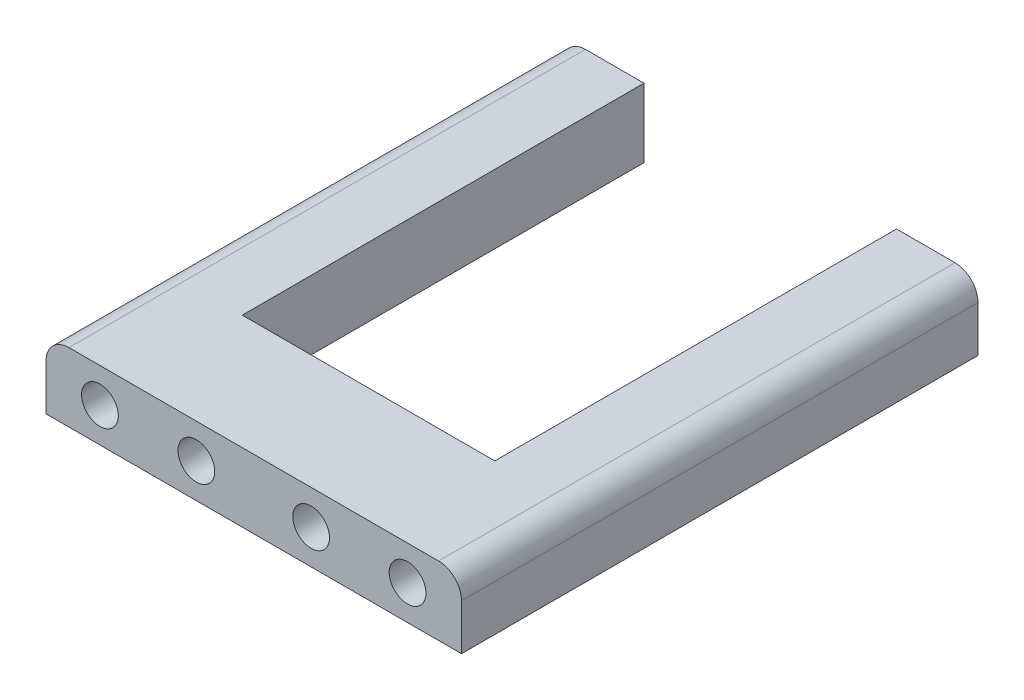
ISO-10303-21;
HEADER;
FILE_DESCRIPTION(('STEP AP214'),'2;1');
FILE_NAME('part.step','',(''),(''),'','','');
FILE_SCHEMA(('AUTOMOTIVE_DESIGN { 1 0 10303 214 1 1 1 1 }'));
ENDSEC;
DATA;
#1=APPLICATION_CONTEXT('core data for automotive mechanical design processes');
#2=APPLICATION_PROTOCOL_DEFINITION('international standard','automotive_design',2000,#1);
#3=PRODUCT_CONTEXT('',#1,'mechanical');
#4=PRODUCT('Part','Part','',(#3));
#5=PRODUCT_RELATED_PRODUCT_CATEGORY('part','',(#4));
#6=PRODUCT_DEFINITION_FORMATION('','',#4);
#7=PRODUCT_DEFINITION_CONTEXT('part definition',#1,'design');
#8=PRODUCT_DEFINITION('design','',#6,#7);
#9=PRODUCT_DEFINITION_SHAPE('','',#8);
#10=(LENGTH_UNIT() NAMED_UNIT(*) SI_UNIT(.MILLI.,.METRE.));
#11=(NAMED_UNIT(*) PLANE_ANGLE_UNIT() SI_UNIT($,.RADIAN.));
#12=(NAMED_UNIT(*) SI_UNIT($,.STERADIAN.) SOLID_ANGLE_UNIT());
#13=UNCERTAINTY_MEASURE_WITH_UNIT(LENGTH_MEASURE(1.E-05),#10,'distance_accuracy_value','');
#14=(GEOMETRIC_REPRESENTATION_CONTEXT(3) GLOBAL_UNCERTAINTY_ASSIGNED_CONTEXT((#13)) GLOBAL_UNIT_ASSIGNED_CONTEXT((#10,
#11,#12)) REPRESENTATION_CONTEXT('',''));
#15=CARTESIAN_POINT('',(0.,0.,0.));
#16=DIRECTION('',(0.,0.,1.));
#17=DIRECTION('',(1.,0.,0.));
#18=AXIS2_PLACEMENT_3D('',#15,#16,#17);
#19=CARTESIAN_POINT('',(-18.1,6.,-22.5));
#20=DIRECTION('',(0.,0.,1.));
#21=DIRECTION('',(1.,0.,0.));
#22=AXIS2_PLACEMENT_3D('',#19,#20,#21);
#23=PLANE('',#22);
#24=CARTESIAN_POINT('',(-13.4,3.,-22.5));
#25=DIRECTION('',(0.,0.,1.));
#26=DIRECTION('',(1.,0.,0.));
#27=AXIS2_PLACEMENT_3D('',#24,#25,#26);
#28=CIRCLE('',#27,1.6);
#29=CARTESIAN_POINT('',(-11.8,3.,-22.5));
#30=VERTEX_POINT('',#29);
#31=EDGE_CURVE('E156',#30,#30,#28,.T.);
#32=ORIENTED_EDGE('',*,*,#31,.T.);
#33=EDGE_LOOP('',(#32));
#34=FACE_BOUND('',#33,.T.);
#35=DIRECTION('',(0.,-1.,0.));
#36=VECTOR('',#35,1.);
#37=CARTESIAN_POINT('',(-18.1,6.,-22.5));
#38=LINE('',#37,#36);
#39=CARTESIAN_POINT('',(-18.1,4.,-22.5));
#40=VERTEX_POINT('',#39);
#41=CARTESIAN_POINT('',(-18.1,0.,-22.5));
#42=VERTEX_POINT('',#41);
#43=EDGE_CURVE('E196',#40,#42,#38,.T.);
#44=ORIENTED_EDGE('',*,*,#43,.F.);
#45=CARTESIAN_POINT('',(-16.1,4.,-22.5));
#46=DIRECTION('',(0.,0.,1.));
#47=DIRECTION('',(1.,0.,0.));
#48=AXIS2_PLACEMENT_3D('',#45,#46,#47);
#49=CIRCLE('',#48,2.);
#50=CARTESIAN_POINT('',(-16.1,6.,-22.5));
#51=VERTEX_POINT('',#50);
#52=EDGE_CURVE('E213',#40,#51,#49,.F.);
#53=ORIENTED_EDGE('',*,*,#52,.T.);
#54=DIRECTION('',(-1.,0.,0.));
#55=VECTOR('',#54,1.);
#56=CARTESIAN_POINT('',(-18.1,6.,-22.5));
#57=LINE('',#56,#55);
#58=CARTESIAN_POINT('',(-11.,6.,-22.5));
#59=VERTEX_POINT('',#58);
#60=EDGE_CURVE('E177',#59,#51,#57,.T.);
#61=ORIENTED_EDGE('',*,*,#60,.F.);
#62=DIRECTION('',(0.,1.,0.));
#63=VECTOR('',#62,1.);
#64=CARTESIAN_POINT('',(-11.,0.,-22.5));
#65=LINE('',#64,#63);
#66=CARTESIAN_POINT('',(-11.,0.,-22.5));
#67=VERTEX_POINT('',#66);
#68=EDGE_CURVE('E118',#67,#59,#65,.T.);
#69=ORIENTED_EDGE('',*,*,#68,.F.);
#70=DIRECTION('',(-1.,0.,0.));
#71=VECTOR('',#70,1.);
#72=CARTESIAN_POINT('',(-18.1,0.,-22.5));
#73=LINE('',#72,#71);
#74=EDGE_CURVE('E183',#67,#42,#73,.T.);
#75=ORIENTED_EDGE('',*,*,#74,.T.);
#76=EDGE_LOOP('',(#44,#53,#61,#69,#75));
#77=FACE_BOUND('',#76,.T.);
#78=ADVANCED_FACE('F37',(#34,#77),#23,.F.);
#79=CARTESIAN_POINT('',(18.1,6.,22.5));
#80=DIRECTION('',(-1.,0.,0.));
#81=DIRECTION('',(0.,0.,1.));
#82=AXIS2_PLACEMENT_3D('',#79,#80,#81);
#83=PLANE('',#82);
#84=DIRECTION('',(0.,-1.,0.));
#85=VECTOR('',#84,1.);
#86=CARTESIAN_POINT('',(18.1,6.,-22.5));
#87=LINE('',#86,#85);
#88=CARTESIAN_POINT('',(18.1,4.,-22.5));
#89=VERTEX_POINT('',#88);
#90=CARTESIAN_POINT('',(18.1,0.,-22.5));
#91=VERTEX_POINT('',#90);
#92=EDGE_CURVE('E198',#89,#91,#87,.T.);
#93=ORIENTED_EDGE('',*,*,#92,.F.);
#94=DIRECTION('',(0.,0.,-1.));
#95=VECTOR('',#94,1.);
#96=CARTESIAN_POINT('',(18.1,4.,22.5));
#97=LINE('',#96,#95);
#98=CARTESIAN_POINT('',(18.1,4.,22.5));
#99=VERTEX_POINT('',#98);
#100=EDGE_CURVE('E11',#89,#99,#97,.F.);
#101=ORIENTED_EDGE('',*,*,#100,.T.);
#102=DIRECTION('',(0.,-1.,0.));
#103=VECTOR('',#102,1.);
#104=CARTESIAN_POINT('',(18.1,6.,22.5));
#105=LINE('',#104,#103);
#106=CARTESIAN_POINT('',(18.1,0.,22.5));
#107=VERTEX_POINT('',#106);
#108=EDGE_CURVE('E180',#99,#107,#105,.T.);
#109=ORIENTED_EDGE('',*,*,#108,.T.);
#110=DIRECTION('',(0.,0.,-1.));
#111=VECTOR('',#110,1.);
#112=CARTESIAN_POINT('',(18.1,0.,22.5));
#113=LINE('',#112,#111);
#114=EDGE_CURVE('E173',#107,#91,#113,.T.);
#115=ORIENTED_EDGE('',*,*,#114,.T.);
#116=EDGE_LOOP('',(#93,#101,#109,#115));
#117=FACE_BOUND('',#116,.T.);
#118=ADVANCED_FACE('F242',(#117),#83,.F.);
#119=CARTESIAN_POINT('',(13.4,3.00000000000003,-22.5));
#120=DIRECTION('',(0.,0.,1.));
#121=DIRECTION('',(-1.,0.,0.));
#122=AXIS2_PLACEMENT_3D('',#119,#120,#121);
#123=CIRCLE('',#122,1.6);
#124=CARTESIAN_POINT('',(15.,3.00000000000003,-22.5));
#125=VERTEX_POINT('',#124);
#126=EDGE_CURVE('E166',#125,#125,#123,.T.);
#127=ORIENTED_EDGE('',*,*,#126,.T.);
#128=EDGE_LOOP('',(#127));
#129=FACE_BOUND('',#128,.T.);
#130=CARTESIAN_POINT('',(16.1,6.,-22.5));
#131=VERTEX_POINT('',#130);
#132=CARTESIAN_POINT('',(11.,6.,-22.5));
#133=VERTEX_POINT('',#132);
#134=EDGE_CURVE('E174',#131,#133,#57,.T.);
#135=ORIENTED_EDGE('',*,*,#134,.F.);
#136=CARTESIAN_POINT('',(16.1,4.,-22.5));
#137=DIRECTION('',(0.,0.,1.));
#138=DIRECTION('',(1.,0.,0.));
#139=AXIS2_PLACEMENT_3D('',#136,#137,#138);
#140=CIRCLE('',#139,2.);
#141=EDGE_CURVE('E45',#131,#89,#140,.F.);
#142=ORIENTED_EDGE('',*,*,#141,.T.);
#143=ORIENTED_EDGE('',*,*,#92,.T.);
#144=CARTESIAN_POINT('',(11.,0.,-22.5));
#145=VERTEX_POINT('',#144);
#146=EDGE_CURVE('E184',#91,#145,#73,.T.);
#147=ORIENTED_EDGE('',*,*,#146,.T.);
#148=DIRECTION('',(0.,-1.,0.));
#149=VECTOR('',#148,1.);
#150=CARTESIAN_POINT('',(11.,0.,-22.5));
#151=LINE('',#150,#149);
#152=EDGE_CURVE('E134',#133,#145,#151,.T.);
#153=ORIENTED_EDGE('',*,*,#152,.F.);
#154=EDGE_LOOP('',(#135,#142,#143,#147,#153));
#155=FACE_BOUND('',#154,.T.);
#156=ADVANCED_FACE('F238',(#129,#155),#23,.F.);
#157=CARTESIAN_POINT('',(-18.1,6.,22.5));
#158=DIRECTION('',(1.,0.,0.));
#159=DIRECTION('',(0.,0.,-1.));
#160=AXIS2_PLACEMENT_3D('',#157,#158,#159);
#161=PLANE('',#160);
#162=DIRECTION('',(0.,-1.,0.));
#163=VECTOR('',#162,1.);
#164=CARTESIAN_POINT('',(-18.1,6.,22.5));
#165=LINE('',#164,#163);
#166=CARTESIAN_POINT('',(-18.1,4.,22.5));
#167=VERTEX_POINT('',#166);
#168=CARTESIAN_POINT('',(-18.1,0.,22.5));
#169=VERTEX_POINT('',#168);
#170=EDGE_CURVE('E194',#167,#169,#165,.T.);
#171=ORIENTED_EDGE('',*,*,#170,.F.);
#172=DIRECTION('',(0.,0.,1.));
#173=VECTOR('',#172,1.);
#174=CARTESIAN_POINT('',(-18.1,4.,22.5));
#175=LINE('',#174,#173);
#176=EDGE_CURVE('E59',#167,#40,#175,.F.);
#177=ORIENTED_EDGE('',*,*,#176,.T.);
#178=ORIENTED_EDGE('',*,*,#43,.T.);
#179=DIRECTION('',(0.,0.,1.));
#180=VECTOR('',#179,1.);
#181=CARTESIAN_POINT('',(-18.1,0.,22.5));
#182=LINE('',#181,#180);
#183=EDGE_CURVE('E187',#42,#169,#182,.T.);
#184=ORIENTED_EDGE('',*,*,#183,.T.);
#185=EDGE_LOOP('',(#171,#177,#178,#184));
#186=FACE_BOUND('',#185,.T.);
#187=ADVANCED_FACE('F223',(#186),#161,.F.);
#188=CARTESIAN_POINT('',(-18.1,6.,22.5));
#189=DIRECTION('',(0.,0.,-1.));
#190=DIRECTION('',(-1.,0.,0.));
#191=AXIS2_PLACEMENT_3D('',#188,#189,#190);
#192=PLANE('',#191);
#193=CARTESIAN_POINT('',(13.4,3.00000000000003,22.5));
#194=DIRECTION('',(0.,0.,1.));
#195=DIRECTION('',(-1.,0.,0.));
#196=AXIS2_PLACEMENT_3D('',#193,#194,#195);
#197=CIRCLE('',#196,1.6);
#198=CARTESIAN_POINT('',(15.,3.00000000000003,22.5));
#199=VERTEX_POINT('',#198);
#200=EDGE_CURVE('E155',#199,#199,#197,.T.);
#201=ORIENTED_EDGE('',*,*,#200,.F.);
#202=EDGE_LOOP('',(#201));
#203=FACE_BOUND('',#202,.T.);
#204=CARTESIAN_POINT('',(5.,3.,22.5));
#205=DIRECTION('',(0.,0.,1.));
#206=DIRECTION('',(-1.,0.,0.));
#207=AXIS2_PLACEMENT_3D('',#204,#205,#206);
#208=CIRCLE('',#207,1.6);
#209=CARTESIAN_POINT('',(6.6,3.,22.5));
#210=VERTEX_POINT('',#209);
#211=EDGE_CURVE('E163',#210,#210,#208,.T.);
#212=ORIENTED_EDGE('',*,*,#211,.F.);
#213=EDGE_LOOP('',(#212));
#214=FACE_BOUND('',#213,.T.);
#215=CARTESIAN_POINT('',(-13.4,3.,22.5));
#216=DIRECTION('',(0.,0.,1.));
#217=DIRECTION('',(1.,0.,0.));
#218=AXIS2_PLACEMENT_3D('',#215,#216,#217);
#219=CIRCLE('',#218,1.6);
#220=CARTESIAN_POINT('',(-11.8,3.,22.5));
#221=VERTEX_POINT('',#220);
#222=EDGE_CURVE('E160',#221,#221,#219,.T.);
#223=ORIENTED_EDGE('',*,*,#222,.F.);
#224=EDGE_LOOP('',(#223));
#225=FACE_BOUND('',#224,.T.);
#226=CARTESIAN_POINT('',(-5.,3.,22.5));
#227=DIRECTION('',(0.,0.,1.));
#228=DIRECTION('',(1.,0.,0.));
#229=AXIS2_PLACEMENT_3D('',#226,#227,#228);
#230=CIRCLE('',#229,1.6);
#231=CARTESIAN_POINT('',(-3.4,3.,22.5));
#232=VERTEX_POINT('',#231);
#233=EDGE_CURVE('E159',#232,#232,#230,.T.);
#234=ORIENTED_EDGE('',*,*,#233,.F.);
#235=EDGE_LOOP('',(#234));
#236=FACE_BOUND('',#235,.T.);
#237=DIRECTION('',(1.,0.,0.));
#238=VECTOR('',#237,1.);
#239=CARTESIAN_POINT('',(-18.1,6.,22.5));
#240=LINE('',#239,#238);
#241=CARTESIAN_POINT('',(-16.1,6.,22.5));
#242=VERTEX_POINT('',#241);
#243=CARTESIAN_POINT('',(16.1,6.,22.5));
#244=VERTEX_POINT('',#243);
#245=EDGE_CURVE('E176',#242,#244,#240,.T.);
#246=ORIENTED_EDGE('',*,*,#245,.F.);
#247=CARTESIAN_POINT('',(-16.1,4.,22.5));
#248=DIRECTION('',(0.,0.,-1.));
#249=DIRECTION('',(-1.,0.,0.));
#250=AXIS2_PLACEMENT_3D('',#247,#248,#249);
#251=CIRCLE('',#250,2.);
#252=EDGE_CURVE('E210',#242,#167,#251,.F.);
#253=ORIENTED_EDGE('',*,*,#252,.T.);
#254=ORIENTED_EDGE('',*,*,#170,.T.);
#255=DIRECTION('',(1.,0.,0.));
#256=VECTOR('',#255,1.);
#257=CARTESIAN_POINT('',(-18.1,0.,22.5));
#258=LINE('',#257,#256);
#259=EDGE_CURVE('E190',#169,#107,#258,.T.);
#260=ORIENTED_EDGE('',*,*,#259,.T.);
#261=ORIENTED_EDGE('',*,*,#108,.F.);
#262=CARTESIAN_POINT('',(16.1,4.,22.5));
#263=DIRECTION('',(0.,0.,-1.));
#264=DIRECTION('',(-1.,0.,0.));
#265=AXIS2_PLACEMENT_3D('',#262,#263,#264);
#266=CIRCLE('',#265,2.);
#267=EDGE_CURVE('E208',#99,#244,#266,.F.);
#268=ORIENTED_EDGE('',*,*,#267,.T.);
#269=EDGE_LOOP('',(#246,#253,#254,#260,#261,#268));
#270=FACE_BOUND('',#269,.T.);
#271=ADVANCED_FACE('F222',(#203,#214,#225,#236,#270),#192,.F.);
#272=CARTESIAN_POINT('',(0.,6.,0.));
#273=DIRECTION('',(0.,-1.,0.));
#274=DIRECTION('',(0.,0.,-1.));
#275=AXIS2_PLACEMENT_3D('',#272,#273,#274);
#276=PLANE('',#275);
#277=ORIENTED_EDGE('',*,*,#60,.T.);
#278=DIRECTION('',(0.,0.,1.));
#279=VECTOR('',#278,1.);
#280=CARTESIAN_POINT('',(-16.1,6.,0.));
#281=LINE('',#280,#279);
#282=EDGE_CURVE('E205',#51,#242,#281,.T.);
#283=ORIENTED_EDGE('',*,*,#282,.T.);
#284=ORIENTED_EDGE('',*,*,#245,.T.);
#285=DIRECTION('',(0.,0.,-1.));
#286=VECTOR('',#285,1.);
#287=CARTESIAN_POINT('',(16.1,6.,0.));
#288=LINE('',#287,#286);
#289=EDGE_CURVE('E200',#244,#131,#288,.T.);
#290=ORIENTED_EDGE('',*,*,#289,.T.);
#291=ORIENTED_EDGE('',*,*,#134,.T.);
#292=DIRECTION('',(0.,0.,-1.));
#293=VECTOR('',#292,1.);
#294=CARTESIAN_POINT('',(11.,6.,12.5));
#295=LINE('',#294,#293);
#296=CARTESIAN_POINT('',(11.,6.,12.5));
#297=VERTEX_POINT('',#296);
#298=EDGE_CURVE('E123',#297,#133,#295,.T.);
#299=ORIENTED_EDGE('',*,*,#298,.F.);
#300=DIRECTION('',(1.,0.,0.));
#301=VECTOR('',#300,1.);
#302=CARTESIAN_POINT('',(11.,6.,12.5));
#303=LINE('',#302,#301);
#304=CARTESIAN_POINT('',(-11.,6.,12.5));
#305=VERTEX_POINT('',#304);
#306=EDGE_CURVE('E130',#305,#297,#303,.T.);
#307=ORIENTED_EDGE('',*,*,#306,.F.);
#308=DIRECTION('',(0.,0.,-1.));
#309=VECTOR('',#308,1.);
#310=CARTESIAN_POINT('',(-11.,6.,12.5));
#311=LINE('',#310,#309);
#312=EDGE_CURVE('E112',#305,#59,#311,.T.);
#313=ORIENTED_EDGE('',*,*,#312,.T.);
#314=EDGE_LOOP('',(#277,#283,#284,#290,#291,#299,#307,#313));
#315=FACE_BOUND('',#314,.T.);
#316=ADVANCED_FACE('F136',(#315),#276,.F.);
#317=CARTESIAN_POINT('',(0.,0.,0.));
#318=DIRECTION('',(0.,-1.,0.));
#319=DIRECTION('',(0.,0.,-1.));
#320=AXIS2_PLACEMENT_3D('',#317,#318,#319);
#321=PLANE('',#320);
#322=DIRECTION('',(0.,0.,-1.));
#323=VECTOR('',#322,1.);
#324=CARTESIAN_POINT('',(-11.,0.,12.5));
#325=LINE('',#324,#323);
#326=CARTESIAN_POINT('',(-11.,0.,12.5));
#327=VERTEX_POINT('',#326);
#328=EDGE_CURVE('E145',#327,#67,#325,.T.);
#329=ORIENTED_EDGE('',*,*,#328,.F.);
#330=DIRECTION('',(-1.,0.,0.));
#331=VECTOR('',#330,1.);
#332=CARTESIAN_POINT('',(11.,0.,12.5));
#333=LINE('',#332,#331);
#334=CARTESIAN_POINT('',(11.,0.,12.5));
#335=VERTEX_POINT('',#334);
#336=EDGE_CURVE('E124',#335,#327,#333,.T.);
#337=ORIENTED_EDGE('',*,*,#336,.F.);
#338=DIRECTION('',(0.,0.,-1.));
#339=VECTOR('',#338,1.);
#340=CARTESIAN_POINT('',(11.,0.,12.5));
#341=LINE('',#340,#339);
#342=EDGE_CURVE('E148',#335,#145,#341,.T.);
#343=ORIENTED_EDGE('',*,*,#342,.T.);
#344=ORIENTED_EDGE('',*,*,#146,.F.);
#345=ORIENTED_EDGE('',*,*,#114,.F.);
#346=ORIENTED_EDGE('',*,*,#259,.F.);
#347=ORIENTED_EDGE('',*,*,#183,.F.);
#348=ORIENTED_EDGE('',*,*,#74,.F.);
#349=EDGE_LOOP('',(#329,#337,#343,#344,#345,#346,#347,#348));
#350=FACE_BOUND('',#349,.T.);
#351=ADVANCED_FACE('F229',(#350),#321,.T.);
#352=CARTESIAN_POINT('',(-5.,3.,-22.5));
#353=DIRECTION('',(0.,0.,1.));
#354=DIRECTION('',(1.,0.,0.));
#355=AXIS2_PLACEMENT_3D('',#352,#353,#354);
#356=CYLINDRICAL_SURFACE('',#355,1.6);
#357=CARTESIAN_POINT('',(-5.,3.,12.5));
#358=DIRECTION('',(0.,0.,1.));
#359=DIRECTION('',(1.,0.,0.));
#360=AXIS2_PLACEMENT_3D('',#357,#358,#359);
#361=CIRCLE('',#360,1.6);
#362=CARTESIAN_POINT('',(-3.4,3.,12.5));
#363=VERTEX_POINT('',#362);
#364=EDGE_CURVE('E152',#363,#363,#361,.F.);
#365=CARTESIAN_POINT('',(-3.4,3.,12.5));
#366=CARTESIAN_POINT('',(-3.4,3.,12.6041666666667));
#367=CARTESIAN_POINT('',(-3.4,3.,12.7083333333333));
#368=CARTESIAN_POINT('',(-3.4,3.,12.9166666666667));
#369=CARTESIAN_POINT('',(-3.4,3.,13.0208333333333));
#370=CARTESIAN_POINT('',(-3.4,3.,13.2291666666667));
#371=CARTESIAN_POINT('',(-3.4,3.,13.3333333333333));
#372=CARTESIAN_POINT('',(-3.4,3.,13.5416666666667));
#373=CARTESIAN_POINT('',(-3.4,3.,13.6458333333333));
#374=CARTESIAN_POINT('',(-3.4,3.,13.8541666666667));
#375=CARTESIAN_POINT('',(-3.4,3.,13.9583333333333));
#376=CARTESIAN_POINT('',(-3.4,3.,14.1666666666667));
#377=CARTESIAN_POINT('',(-3.4,3.,14.2708333333333));
#378=CARTESIAN_POINT('',(-3.4,3.,14.4791666666667));
#379=CARTESIAN_POINT('',(-3.4,3.,14.5833333333333));
#380=CARTESIAN_POINT('',(-3.4,3.,14.7916666666667));
#381=CARTESIAN_POINT('',(-3.4,3.,14.8958333333333));
#382=CARTESIAN_POINT('',(-3.4,3.,15.1041666666667));
#383=CARTESIAN_POINT('',(-3.4,3.,15.2083333333333));
#384=CARTESIAN_POINT('',(-3.4,3.,15.4166666666667));
#385=CARTESIAN_POINT('',(-3.4,3.,15.5208333333333));
#386=CARTESIAN_POINT('',(-3.4,3.,15.7291666666667));
#387=CARTESIAN_POINT('',(-3.4,3.,15.8333333333333));
#388=CARTESIAN_POINT('',(-3.4,3.,16.0416666666667));
#389=CARTESIAN_POINT('',(-3.4,3.,16.1458333333333));
#390=CARTESIAN_POINT('',(-3.4,3.,16.3541666666667));
#391=CARTESIAN_POINT('',(-3.4,3.,16.4583333333333));
#392=CARTESIAN_POINT('',(-3.4,3.,16.6666666666667));
#393=CARTESIAN_POINT('',(-3.4,3.,16.7708333333333));
#394=CARTESIAN_POINT('',(-3.4,3.,16.9791666666667));
#395=CARTESIAN_POINT('',(-3.4,3.,17.0833333333333));
#396=CARTESIAN_POINT('',(-3.4,3.,17.2916666666667));
#397=CARTESIAN_POINT('',(-3.4,3.,17.3958333333333));
#398=CARTESIAN_POINT('',(-3.4,3.,17.6041666666667));
#399=CARTESIAN_POINT('',(-3.4,3.,17.7083333333333));
#400=CARTESIAN_POINT('',(-3.4,3.,17.9166666666667));
#401=CARTESIAN_POINT('',(-3.4,3.,18.0208333333333));
#402=CARTESIAN_POINT('',(-3.4,3.,18.2291666666667));
#403=CARTESIAN_POINT('',(-3.4,3.,18.3333333333333));
#404=CARTESIAN_POINT('',(-3.4,3.,18.5416666666667));
#405=CARTESIAN_POINT('',(-3.4,3.,18.6458333333333));
#406=CARTESIAN_POINT('',(-3.4,3.,18.8541666666667));
#407=CARTESIAN_POINT('',(-3.4,3.,18.9583333333333));
#408=CARTESIAN_POINT('',(-3.4,3.,19.1666666666667));
#409=CARTESIAN_POINT('',(-3.4,3.,19.2708333333333));
#410=CARTESIAN_POINT('',(-3.4,3.,19.4791666666667));
#411=CARTESIAN_POINT('',(-3.4,3.,19.5833333333333));
#412=CARTESIAN_POINT('',(-3.4,3.,19.7916666666667));
#413=CARTESIAN_POINT('',(-3.4,3.,19.8958333333333));
#414=CARTESIAN_POINT('',(-3.4,3.,20.1041666666667));
#415=CARTESIAN_POINT('',(-3.4,3.,20.2083333333333));
#416=CARTESIAN_POINT('',(-3.4,3.,20.4166666666667));
#417=CARTESIAN_POINT('',(-3.4,3.,20.5208333333333));
#418=CARTESIAN_POINT('',(-3.4,3.,20.7291666666667));
#419=CARTESIAN_POINT('',(-3.4,3.,20.8333333333333));
#420=CARTESIAN_POINT('',(-3.4,3.,21.0416666666667));
#421=CARTESIAN_POINT('',(-3.4,3.,21.1458333333333));
#422=CARTESIAN_POINT('',(-3.4,3.,21.3541666666667));
#423=CARTESIAN_POINT('',(-3.4,3.,21.4583333333333));
#424=CARTESIAN_POINT('',(-3.4,3.,21.6666666666667));
#425=CARTESIAN_POINT('',(-3.4,3.,21.7708333333333));
#426=CARTESIAN_POINT('',(-3.4,3.,21.9791666666667));
#427=CARTESIAN_POINT('',(-3.4,3.,22.0833333333333));
#428=CARTESIAN_POINT('',(-3.4,3.,22.2916666666667));
#429=CARTESIAN_POINT('',(-3.4,3.,22.3958333333333));
#430=CARTESIAN_POINT('',(-3.4,3.,22.5));
#431=B_SPLINE_CURVE_WITH_KNOTS('',3,(#365,#366,#367,#368,#369,#370,#371,#372,#373,#374,#375,
#376,#377,#378,#379,#380,#381,#382,#383,#384,#385,#386,#387,#388,#389,#390,#391,#392,#393,#394,
#395,#396,#397,#398,#399,#400,#401,#402,#403,#404,#405,#406,#407,#408,#409,#410,#411,#412,#413,
#414,#415,#416,#417,#418,#419,#420,#421,#422,#423,#424,#425,#426,#427,#428,#429,#430),
.UNSPECIFIED.,.F.,.F.,(4,2,2,2,2,2,2,2,2,2,2,2,2,2,2,2,2,2,2,2,2,2,2,2,2,2,2,2,2,2,2,2,4),(0.,
0.3125,0.625000000000001,0.937500000000001,1.25,1.56249999999999,1.87499999999999,2.1875,2.5,
2.8125,3.125,3.4375,3.74999999999999,4.06249999999999,4.37499999999999,4.68749999999999,
4.99999999999999,5.31249999999999,5.62499999999999,5.93749999999999,6.24999999999999,
6.56249999999998,6.87499999999998,7.18749999999999,7.49999999999999,7.81249999999999,
8.12499999999999,8.43749999999999,8.74999999999998,9.06249999999999,9.37499999999998,
9.68749999999998,9.99999999999998),.UNSPECIFIED.);
#432=EDGE_CURVE('BSEAM269',#363,#232,#431,.T.);
#433=ORIENTED_EDGE('',*,*,#364,.T.);
#434=ORIENTED_EDGE('',*,*,#233,.T.);
#435=ORIENTED_EDGE('',*,*,#432,.T.);
#436=ORIENTED_EDGE('',*,*,#432,.F.);
#437=EDGE_LOOP('',(#433,#435,#434,#436));
#438=FACE_BOUND('',#437,.T.);
#439=ADVANCED_FACE('F269',(#438),#356,.F.);
#440=CARTESIAN_POINT('',(-13.4,3.,-22.5));
#441=DIRECTION('',(0.,0.,1.));
#442=DIRECTION('',(1.,0.,0.));
#443=AXIS2_PLACEMENT_3D('',#440,#441,#442);
#444=CYLINDRICAL_SURFACE('',#443,1.6);
#445=CARTESIAN_POINT('',(-11.8,3.,-22.5));
#446=CARTESIAN_POINT('',(-11.8,3.,-22.03125));
#447=CARTESIAN_POINT('',(-11.8,3.,-21.5625));
#448=CARTESIAN_POINT('',(-11.8,3.,-20.625));
#449=CARTESIAN_POINT('',(-11.8,3.,-20.15625));
#450=CARTESIAN_POINT('',(-11.8,3.,-19.21875));
#451=CARTESIAN_POINT('',(-11.8,3.,-18.75));
#452=CARTESIAN_POINT('',(-11.8,3.,-17.8125));
#453=CARTESIAN_POINT('',(-11.8,3.,-17.34375));
#454=CARTESIAN_POINT('',(-11.8,3.,-16.40625));
#455=CARTESIAN_POINT('',(-11.8,3.,-15.9375));
#456=CARTESIAN_POINT('',(-11.8,3.,-15.));
#457=CARTESIAN_POINT('',(-11.8,3.,-14.53125));
#458=CARTESIAN_POINT('',(-11.8,3.,-13.59375));
#459=CARTESIAN_POINT('',(-11.8,3.,-13.125));
#460=CARTESIAN_POINT('',(-11.8,3.,-12.1875));
#461=CARTESIAN_POINT('',(-11.8,3.,-11.71875));
#462=CARTESIAN_POINT('',(-11.8,3.,-10.78125));
#463=CARTESIAN_POINT('',(-11.8,3.,-10.3125));
#464=CARTESIAN_POINT('',(-11.8,3.,-9.375));
#465=CARTESIAN_POINT('',(-11.8,3.,-8.90625));
#466=CARTESIAN_POINT('',(-11.8,3.,-7.96875));
#467=CARTESIAN_POINT('',(-11.8,3.,-7.5));
#468=CARTESIAN_POINT('',(-11.8,3.,-6.5625));
#469=CARTESIAN_POINT('',(-11.8,3.,-6.09375));
#470=CARTESIAN_POINT('',(-11.8,3.,-5.15625));
#471=CARTESIAN_POINT('',(-11.8,3.,-4.6875));
#472=CARTESIAN_POINT('',(-11.8,3.,-3.75));
#473=CARTESIAN_POINT('',(-11.8,3.,-3.28125));
#474=CARTESIAN_POINT('',(-11.8,3.,-2.34375));
#475=CARTESIAN_POINT('',(-11.8,3.,-1.875));
#476=CARTESIAN_POINT('',(-11.8,3.,-0.937500000000004));
#477=CARTESIAN_POINT('',(-11.8,3.,-0.468750000000004));
#478=CARTESIAN_POINT('',(-11.8,3.,0.468749999999997));
#479=CARTESIAN_POINT('',(-11.8,3.,0.937499999999997));
#480=CARTESIAN_POINT('',(-11.8,3.,1.875));
#481=CARTESIAN_POINT('',(-11.8,3.,2.34375));
#482=CARTESIAN_POINT('',(-11.8,3.,3.28125));
#483=CARTESIAN_POINT('',(-11.8,3.,3.75));
#484=CARTESIAN_POINT('',(-11.8,3.,4.6875));
#485=CARTESIAN_POINT('',(-11.8,3.,5.15624999999999));
#486=CARTESIAN_POINT('',(-11.8,3.,6.09374999999999));
#487=CARTESIAN_POINT('',(-11.8,3.,6.5625));
#488=CARTESIAN_POINT('',(-11.8,3.,7.5));
#489=CARTESIAN_POINT('',(-11.8,3.,7.96875));
#490=CARTESIAN_POINT('',(-11.8,3.,8.90625));
#491=CARTESIAN_POINT('',(-11.8,3.,9.37499999999999));
#492=CARTESIAN_POINT('',(-11.8,3.,10.3125));
#493=CARTESIAN_POINT('',(-11.8,3.,10.78125));
#494=CARTESIAN_POINT('',(-11.8,3.,11.71875));
#495=CARTESIAN_POINT('',(-11.8,3.,12.1875));
#496=CARTESIAN_POINT('',(-11.8,3.,13.125));
#497=CARTESIAN_POINT('',(-11.8,3.,13.59375));
#498=CARTESIAN_POINT('',(-11.8,3.,14.53125));
#499=CARTESIAN_POINT('',(-11.8,3.,15.));
#500=CARTESIAN_POINT('',(-11.8,3.,15.9375));
#501=CARTESIAN_POINT('',(-11.8,3.,16.40625));
#502=CARTESIAN_POINT('',(-11.8,3.,17.34375));
#503=CARTESIAN_POINT('',(-11.8,3.,17.8125));
#504=CARTESIAN_POINT('',(-11.8,3.,18.75));
#505=CARTESIAN_POINT('',(-11.8,3.,19.21875));
#506=CARTESIAN_POINT('',(-11.8,3.,20.15625));
#507=CARTESIAN_POINT('',(-11.8,3.,20.625));
#508=CARTESIAN_POINT('',(-11.8,3.,21.5625));
#509=CARTESIAN_POINT('',(-11.8,3.,22.03125));
#510=CARTESIAN_POINT('',(-11.8,3.,22.5));
#511=B_SPLINE_CURVE_WITH_KNOTS('',3,(#445,#446,#447,#448,#449,#450,#451,#452,#453,#454,#455,
#456,#457,#458,#459,#460,#461,#462,#463,#464,#465,#466,#467,#468,#469,#470,#471,#472,#473,#474,
#475,#476,#477,#478,#479,#480,#481,#482,#483,#484,#485,#486,#487,#488,#489,#490,#491,#492,#493,
#494,#495,#496,#497,#498,#499,#500,#501,#502,#503,#504,#505,#506,#507,#508,#509,#510),
.UNSPECIFIED.,.F.,.F.,(4,2,2,2,2,2,2,2,2,2,2,2,2,2,2,2,2,2,2,2,2,2,2,2,2,2,2,2,2,2,2,2,4),(0.,
1.40625,2.8125,4.21875,5.625,7.03125,8.4375,9.84375,11.25,12.65625,14.0625,15.46875,16.875,
18.28125,19.6875,21.09375,22.5,23.90625,25.3125,26.71875,28.125,29.53125,30.9375,32.34375,33.75,
35.15625,36.5625,37.96875,39.375,40.78125,42.1875,43.59375,45.),.UNSPECIFIED.);
#512=EDGE_CURVE('BSEAM265',#30,#221,#511,.T.);
#513=ORIENTED_EDGE('',*,*,#31,.F.);
#514=ORIENTED_EDGE('',*,*,#222,.T.);
#515=ORIENTED_EDGE('',*,*,#512,.T.);
#516=ORIENTED_EDGE('',*,*,#512,.F.);
#517=EDGE_LOOP('',(#513,#515,#514,#516));
#518=FACE_BOUND('',#517,.T.);
#519=ADVANCED_FACE('F265',(#518),#444,.F.);
#520=CARTESIAN_POINT('',(5.,3.,-22.5));
#521=DIRECTION('',(0.,0.,1.));
#522=DIRECTION('',(1.,0.,0.));
#523=AXIS2_PLACEMENT_3D('',#520,#521,#522);
#524=CYLINDRICAL_SURFACE('',#523,1.6);
#525=CARTESIAN_POINT('',(5.,3.,12.5));
#526=DIRECTION('',(0.,0.,1.));
#527=DIRECTION('',(1.,0.,0.));
#528=AXIS2_PLACEMENT_3D('',#525,#526,#527);
#529=CIRCLE('',#528,1.6);
#530=CARTESIAN_POINT('',(6.6,3.,12.5));
#531=VERTEX_POINT('',#530);
#532=EDGE_CURVE('E147',#531,#531,#529,.F.);
#533=CARTESIAN_POINT('',(6.6,3.,12.5));
#534=CARTESIAN_POINT('',(6.6,3.,12.6041666666667));
#535=CARTESIAN_POINT('',(6.6,3.,12.7083333333333));
#536=CARTESIAN_POINT('',(6.6,3.,12.9166666666667));
#537=CARTESIAN_POINT('',(6.6,3.,13.0208333333333));
#538=CARTESIAN_POINT('',(6.6,3.,13.2291666666667));
#539=CARTESIAN_POINT('',(6.6,3.,13.3333333333333));
#540=CARTESIAN_POINT('',(6.6,3.,13.5416666666667));
#541=CARTESIAN_POINT('',(6.6,3.,13.6458333333333));
#542=CARTESIAN_POINT('',(6.6,3.,13.8541666666667));
#543=CARTESIAN_POINT('',(6.6,3.,13.9583333333333));
#544=CARTESIAN_POINT('',(6.6,3.,14.1666666666667));
#545=CARTESIAN_POINT('',(6.6,3.,14.2708333333333));
#546=CARTESIAN_POINT('',(6.6,3.,14.4791666666667));
#547=CARTESIAN_POINT('',(6.6,3.,14.5833333333333));
#548=CARTESIAN_POINT('',(6.6,3.,14.7916666666667));
#549=CARTESIAN_POINT('',(6.6,3.,14.8958333333333));
#550=CARTESIAN_POINT('',(6.6,3.,15.1041666666667));
#551=CARTESIAN_POINT('',(6.6,3.,15.2083333333333));
#552=CARTESIAN_POINT('',(6.6,3.,15.4166666666667));
#553=CARTESIAN_POINT('',(6.6,3.,15.5208333333333));
#554=CARTESIAN_POINT('',(6.6,3.,15.7291666666667));
#555=CARTESIAN_POINT('',(6.6,3.,15.8333333333333));
#556=CARTESIAN_POINT('',(6.6,3.,16.0416666666667));
#557=CARTESIAN_POINT('',(6.6,3.,16.1458333333333));
#558=CARTESIAN_POINT('',(6.6,3.,16.3541666666667));
#559=CARTESIAN_POINT('',(6.6,3.,16.4583333333333));
#560=CARTESIAN_POINT('',(6.6,3.,16.6666666666667));
#561=CARTESIAN_POINT('',(6.6,3.,16.7708333333333));
#562=CARTESIAN_POINT('',(6.6,3.,16.9791666666667));
#563=CARTESIAN_POINT('',(6.6,3.,17.0833333333333));
#564=CARTESIAN_POINT('',(6.6,3.,17.2916666666667));
#565=CARTESIAN_POINT('',(6.6,3.,17.3958333333333));
#566=CARTESIAN_POINT('',(6.6,3.,17.6041666666667));
#567=CARTESIAN_POINT('',(6.6,3.,17.7083333333333));
#568=CARTESIAN_POINT('',(6.6,3.,17.9166666666667));
#569=CARTESIAN_POINT('',(6.6,3.,18.0208333333333));
#570=CARTESIAN_POINT('',(6.6,3.,18.2291666666667));
#571=CARTESIAN_POINT('',(6.6,3.,18.3333333333333));
#572=CARTESIAN_POINT('',(6.6,3.,18.5416666666667));
#573=CARTESIAN_POINT('',(6.6,3.,18.6458333333333));
#574=CARTESIAN_POINT('',(6.6,3.,18.8541666666667));
#575=CARTESIAN_POINT('',(6.6,3.,18.9583333333333));
#576=CARTESIAN_POINT('',(6.6,3.,19.1666666666667));
#577=CARTESIAN_POINT('',(6.6,3.,19.2708333333333));
#578=CARTESIAN_POINT('',(6.6,3.,19.4791666666667));
#579=CARTESIAN_POINT('',(6.6,3.,19.5833333333333));
#580=CARTESIAN_POINT('',(6.6,3.,19.7916666666667));
#581=CARTESIAN_POINT('',(6.6,3.,19.8958333333333));
#582=CARTESIAN_POINT('',(6.6,3.,20.1041666666667));
#583=CARTESIAN_POINT('',(6.6,3.,20.2083333333333));
#584=CARTESIAN_POINT('',(6.6,3.,20.4166666666667));
#585=CARTESIAN_POINT('',(6.6,3.,20.5208333333333));
#586=CARTESIAN_POINT('',(6.6,3.,20.7291666666667));
#587=CARTESIAN_POINT('',(6.6,3.,20.8333333333333));
#588=CARTESIAN_POINT('',(6.6,3.,21.0416666666667));
#589=CARTESIAN_POINT('',(6.6,3.,21.1458333333333));
#590=CARTESIAN_POINT('',(6.6,3.,21.3541666666667));
#591=CARTESIAN_POINT('',(6.6,3.,21.4583333333333));
#592=CARTESIAN_POINT('',(6.6,3.,21.6666666666667));
#593=CARTESIAN_POINT('',(6.6,3.,21.7708333333333));
#594=CARTESIAN_POINT('',(6.6,3.,21.9791666666667));
#595=CARTESIAN_POINT('',(6.6,3.,22.0833333333333));
#596=CARTESIAN_POINT('',(6.6,3.,22.2916666666667));
#597=CARTESIAN_POINT('',(6.6,3.,22.3958333333333));
#598=CARTESIAN_POINT('',(6.6,3.,22.5));
#599=B_SPLINE_CURVE_WITH_KNOTS('',3,(#533,#534,#535,#536,#537,#538,#539,#540,#541,#542,#543,
#544,#545,#546,#547,#548,#549,#550,#551,#552,#553,#554,#555,#556,#557,#558,#559,#560,#561,#562,
#563,#564,#565,#566,#567,#568,#569,#570,#571,#572,#573,#574,#575,#576,#577,#578,#579,#580,#581,
#582,#583,#584,#585,#586,#587,#588,#589,#590,#591,#592,#593,#594,#595,#596,#597,#598),
.UNSPECIFIED.,.F.,.F.,(4,2,2,2,2,2,2,2,2,2,2,2,2,2,2,2,2,2,2,2,2,2,2,2,2,2,2,2,2,2,2,2,4),(0.,
0.3125,0.625000000000001,0.937500000000001,1.25,1.56249999999999,1.87499999999999,2.1875,2.5,
2.8125,3.125,3.4375,3.74999999999999,4.06249999999999,4.37499999999999,4.68749999999999,
4.99999999999999,5.31249999999999,5.62499999999999,5.93749999999999,6.24999999999999,
6.56249999999998,6.87499999999998,7.18749999999999,7.49999999999999,7.81249999999999,
8.12499999999999,8.43749999999999,8.74999999999998,9.06249999999999,9.37499999999998,
9.68749999999998,9.99999999999998),.UNSPECIFIED.);
#600=EDGE_CURVE('BSEAM268',#531,#210,#599,.T.);
#601=ORIENTED_EDGE('',*,*,#532,.T.);
#602=ORIENTED_EDGE('',*,*,#211,.T.);
#603=ORIENTED_EDGE('',*,*,#600,.T.);
#604=ORIENTED_EDGE('',*,*,#600,.F.);
#605=EDGE_LOOP('',(#601,#603,#602,#604));
#606=FACE_BOUND('',#605,.T.);
#607=ADVANCED_FACE('F268',(#606),#524,.F.);
#608=CARTESIAN_POINT('',(13.4,3.00000000000003,-22.5));
#609=DIRECTION('',(0.,0.,1.));
#610=DIRECTION('',(1.,0.,0.));
#611=AXIS2_PLACEMENT_3D('',#608,#609,#610);
#612=CYLINDRICAL_SURFACE('',#611,1.6);
#613=CARTESIAN_POINT('',(15.,3.00000000000003,-22.5));
#614=CARTESIAN_POINT('',(15.,3.00000000000003,-22.03125));
#615=CARTESIAN_POINT('',(15.,3.00000000000003,-21.5625));
#616=CARTESIAN_POINT('',(15.,3.00000000000003,-20.625));
#617=CARTESIAN_POINT('',(15.,3.00000000000003,-20.15625));
#618=CARTESIAN_POINT('',(15.,3.00000000000003,-19.21875));
#619=CARTESIAN_POINT('',(15.,3.00000000000003,-18.75));
#620=CARTESIAN_POINT('',(15.,3.00000000000003,-17.8125));
#621=CARTESIAN_POINT('',(15.,3.00000000000003,-17.34375));
#622=CARTESIAN_POINT('',(15.,3.00000000000003,-16.40625));
#623=CARTESIAN_POINT('',(15.,3.00000000000003,-15.9375));
#624=CARTESIAN_POINT('',(15.,3.00000000000003,-15.));
#625=CARTESIAN_POINT('',(15.,3.00000000000003,-14.53125));
#626=CARTESIAN_POINT('',(15.,3.00000000000003,-13.59375));
#627=CARTESIAN_POINT('',(15.,3.00000000000003,-13.125));
#628=CARTESIAN_POINT('',(15.,3.00000000000003,-12.1875));
#629=CARTESIAN_POINT('',(15.,3.00000000000003,-11.71875));
#630=CARTESIAN_POINT('',(15.,3.00000000000003,-10.78125));
#631=CARTESIAN_POINT('',(15.,3.00000000000003,-10.3125));
#632=CARTESIAN_POINT('',(15.,3.00000000000003,-9.375));
#633=CARTESIAN_POINT('',(15.,3.00000000000003,-8.90625));
#634=CARTESIAN_POINT('',(15.,3.00000000000003,-7.96875));
#635=CARTESIAN_POINT('',(15.,3.00000000000003,-7.5));
#636=CARTESIAN_POINT('',(15.,3.00000000000003,-6.5625));
#637=CARTESIAN_POINT('',(15.,3.00000000000003,-6.09375));
#638=CARTESIAN_POINT('',(15.,3.00000000000003,-5.15625));
#639=CARTESIAN_POINT('',(15.,3.00000000000003,-4.6875));
#640=CARTESIAN_POINT('',(15.,3.00000000000003,-3.75));
#641=CARTESIAN_POINT('',(15.,3.00000000000003,-3.28125));
#642=CARTESIAN_POINT('',(15.,3.00000000000003,-2.34375));
#643=CARTESIAN_POINT('',(15.,3.00000000000003,-1.875));
#644=CARTESIAN_POINT('',(15.,3.00000000000003,-0.937500000000004));
#645=CARTESIAN_POINT('',(15.,3.00000000000003,-0.468750000000004));
#646=CARTESIAN_POINT('',(15.,3.00000000000003,0.468749999999997));
#647=CARTESIAN_POINT('',(15.,3.00000000000003,0.937499999999997));
#648=CARTESIAN_POINT('',(15.,3.00000000000003,1.875));
#649=CARTESIAN_POINT('',(15.,3.00000000000003,2.34375));
#650=CARTESIAN_POINT('',(15.,3.00000000000003,3.28125));
#651=CARTESIAN_POINT('',(15.,3.00000000000003,3.75));
#652=CARTESIAN_POINT('',(15.,3.00000000000003,4.6875));
#653=CARTESIAN_POINT('',(15.,3.00000000000003,5.15624999999999));
#654=CARTESIAN_POINT('',(15.,3.00000000000003,6.09374999999999));
#655=CARTESIAN_POINT('',(15.,3.00000000000003,6.5625));
#656=CARTESIAN_POINT('',(15.,3.00000000000003,7.5));
#657=CARTESIAN_POINT('',(15.,3.00000000000003,7.96875));
#658=CARTESIAN_POINT('',(15.,3.00000000000003,8.90625));
#659=CARTESIAN_POINT('',(15.,3.00000000000003,9.37499999999999));
#660=CARTESIAN_POINT('',(15.,3.00000000000003,10.3125));
#661=CARTESIAN_POINT('',(15.,3.00000000000003,10.78125));
#662=CARTESIAN_POINT('',(15.,3.00000000000003,11.71875));
#663=CARTESIAN_POINT('',(15.,3.00000000000003,12.1875));
#664=CARTESIAN_POINT('',(15.,3.00000000000003,13.125));
#665=CARTESIAN_POINT('',(15.,3.00000000000003,13.59375));
#666=CARTESIAN_POINT('',(15.,3.00000000000003,14.53125));
#667=CARTESIAN_POINT('',(15.,3.00000000000003,15.));
#668=CARTESIAN_POINT('',(15.,3.00000000000003,15.9375));
#669=CARTESIAN_POINT('',(15.,3.00000000000003,16.40625));
#670=CARTESIAN_POINT('',(15.,3.00000000000003,17.34375));
#671=CARTESIAN_POINT('',(15.,3.00000000000003,17.8125));
#672=CARTESIAN_POINT('',(15.,3.00000000000003,18.75));
#673=CARTESIAN_POINT('',(15.,3.00000000000003,19.21875));
#674=CARTESIAN_POINT('',(15.,3.00000000000003,20.15625));
#675=CARTESIAN_POINT('',(15.,3.00000000000003,20.625));
#676=CARTESIAN_POINT('',(15.,3.00000000000003,21.5625));
#677=CARTESIAN_POINT('',(15.,3.00000000000003,22.03125));
#678=CARTESIAN_POINT('',(15.,3.00000000000003,22.5));
#679=B_SPLINE_CURVE_WITH_KNOTS('',3,(#613,#614,#615,#616,#617,#618,#619,#620,#621,#622,#623,
#624,#625,#626,#627,#628,#629,#630,#631,#632,#633,#634,#635,#636,#637,#638,#639,#640,#641,#642,
#643,#644,#645,#646,#647,#648,#649,#650,#651,#652,#653,#654,#655,#656,#657,#658,#659,#660,#661,
#662,#663,#664,#665,#666,#667,#668,#669,#670,#671,#672,#673,#674,#675,#676,#677,#678),
.UNSPECIFIED.,.F.,.F.,(4,2,2,2,2,2,2,2,2,2,2,2,2,2,2,2,2,2,2,2,2,2,2,2,2,2,2,2,2,2,2,2,4),(0.,
1.40625,2.8125,4.21875,5.625,7.03125,8.4375,9.84375,11.25,12.65625,14.0625,15.46875,16.875,
18.28125,19.6875,21.09375,22.5,23.90625,25.3125,26.71875,28.125,29.53125,30.9375,32.34375,33.75,
35.15625,36.5625,37.96875,39.375,40.78125,42.1875,43.59375,45.),.UNSPECIFIED.);
#680=EDGE_CURVE('BSEAM273',#125,#199,#679,.T.);
#681=ORIENTED_EDGE('',*,*,#126,.F.);
#682=ORIENTED_EDGE('',*,*,#200,.T.);
#683=ORIENTED_EDGE('',*,*,#680,.T.);
#684=ORIENTED_EDGE('',*,*,#680,.F.);
#685=EDGE_LOOP('',(#681,#683,#682,#684));
#686=FACE_BOUND('',#685,.T.);
#687=ADVANCED_FACE('F273',(#686),#612,.F.);
#688=CARTESIAN_POINT('',(0.,0.,12.5));
#689=DIRECTION('',(0.,0.,1.));
#690=DIRECTION('',(1.,0.,0.));
#691=AXIS2_PLACEMENT_3D('',#688,#689,#690);
#692=PLANE('',#691);
#693=ORIENTED_EDGE('',*,*,#532,.F.);
#694=EDGE_LOOP('',(#693));
#695=FACE_BOUND('',#694,.T.);
#696=DIRECTION('',(0.,1.,0.));
#697=VECTOR('',#696,1.);
#698=CARTESIAN_POINT('',(-11.,0.,12.5));
#699=LINE('',#698,#697);
#700=EDGE_CURVE('E115',#327,#305,#699,.T.);
#701=ORIENTED_EDGE('',*,*,#700,.T.);
#702=ORIENTED_EDGE('',*,*,#306,.T.);
#703=DIRECTION('',(0.,-1.,0.));
#704=VECTOR('',#703,1.);
#705=CARTESIAN_POINT('',(11.,0.,12.5));
#706=LINE('',#705,#704);
#707=EDGE_CURVE('E138',#297,#335,#706,.T.);
#708=ORIENTED_EDGE('',*,*,#707,.T.);
#709=ORIENTED_EDGE('',*,*,#336,.T.);
#710=EDGE_LOOP('',(#701,#702,#708,#709));
#711=FACE_BOUND('',#710,.T.);
#712=ORIENTED_EDGE('',*,*,#364,.F.);
#713=EDGE_LOOP('',(#712));
#714=FACE_BOUND('',#713,.T.);
#715=ADVANCED_FACE('F128',(#695,#711,#714),#692,.F.);
#716=CARTESIAN_POINT('',(-11.,0.,12.5));
#717=DIRECTION('',(-1.,0.,0.));
#718=DIRECTION('',(0.,0.,1.));
#719=AXIS2_PLACEMENT_3D('',#716,#717,#718);
#720=PLANE('',#719);
#721=ORIENTED_EDGE('',*,*,#68,.T.);
#722=ORIENTED_EDGE('',*,*,#312,.F.);
#723=ORIENTED_EDGE('',*,*,#700,.F.);
#724=ORIENTED_EDGE('',*,*,#328,.T.);
#725=EDGE_LOOP('',(#721,#722,#723,#724));
#726=FACE_BOUND('',#725,.T.);
#727=ADVANCED_FACE('F114',(#726),#720,.F.);
#728=CARTESIAN_POINT('',(11.,0.,12.5));
#729=DIRECTION('',(1.,0.,0.));
#730=DIRECTION('',(0.,0.,-1.));
#731=AXIS2_PLACEMENT_3D('',#728,#729,#730);
#732=PLANE('',#731);
#733=ORIENTED_EDGE('',*,*,#152,.T.);
#734=ORIENTED_EDGE('',*,*,#342,.F.);
#735=ORIENTED_EDGE('',*,*,#707,.F.);
#736=ORIENTED_EDGE('',*,*,#298,.T.);
#737=EDGE_LOOP('',(#733,#734,#735,#736));
#738=FACE_BOUND('',#737,.T.);
#739=ADVANCED_FACE('F241',(#738),#732,.F.);
#740=CARTESIAN_POINT('',(-16.1,4.,0.));
#741=DIRECTION('',(0.,0.,1.));
#742=DIRECTION('',(1.,0.,0.));
#743=AXIS2_PLACEMENT_3D('',#740,#741,#742);
#744=CYLINDRICAL_SURFACE('',#743,2.);
#745=ORIENTED_EDGE('',*,*,#52,.F.);
#746=ORIENTED_EDGE('',*,*,#176,.F.);
#747=ORIENTED_EDGE('',*,*,#252,.F.);
#748=ORIENTED_EDGE('',*,*,#282,.F.);
#749=EDGE_LOOP('',(#745,#746,#747,#748));
#750=FACE_BOUND('',#749,.T.);
#751=ADVANCED_FACE('F220',(#750),#744,.T.);
#752=CARTESIAN_POINT('',(16.1,4.,0.));
#753=DIRECTION('',(0.,0.,-1.));
#754=DIRECTION('',(-1.,0.,0.));
#755=AXIS2_PLACEMENT_3D('',#752,#753,#754);
#756=CYLINDRICAL_SURFACE('',#755,2.);
#757=ORIENTED_EDGE('',*,*,#267,.F.);
#758=ORIENTED_EDGE('',*,*,#100,.F.);
#759=ORIENTED_EDGE('',*,*,#141,.F.);
#760=ORIENTED_EDGE('',*,*,#289,.F.);
#761=EDGE_LOOP('',(#757,#758,#759,#760));
#762=FACE_BOUND('',#761,.T.);
#763=ADVANCED_FACE('F39',(#762),#756,.T.);
#764=CLOSED_SHELL('',(#78,#118,#156,#187,#271,#316,#351,#439,#519,#607,#687,#715,#727,#739,#751,#763));
#765=MANIFOLD_SOLID_BREP('B2',#764);
#766=ADVANCED_BREP_SHAPE_REPRESENTATION('',(#18,#765),#14);
#767=SHAPE_DEFINITION_REPRESENTATION(#9,#766);
ENDSEC;
END-ISO-10303-21;
